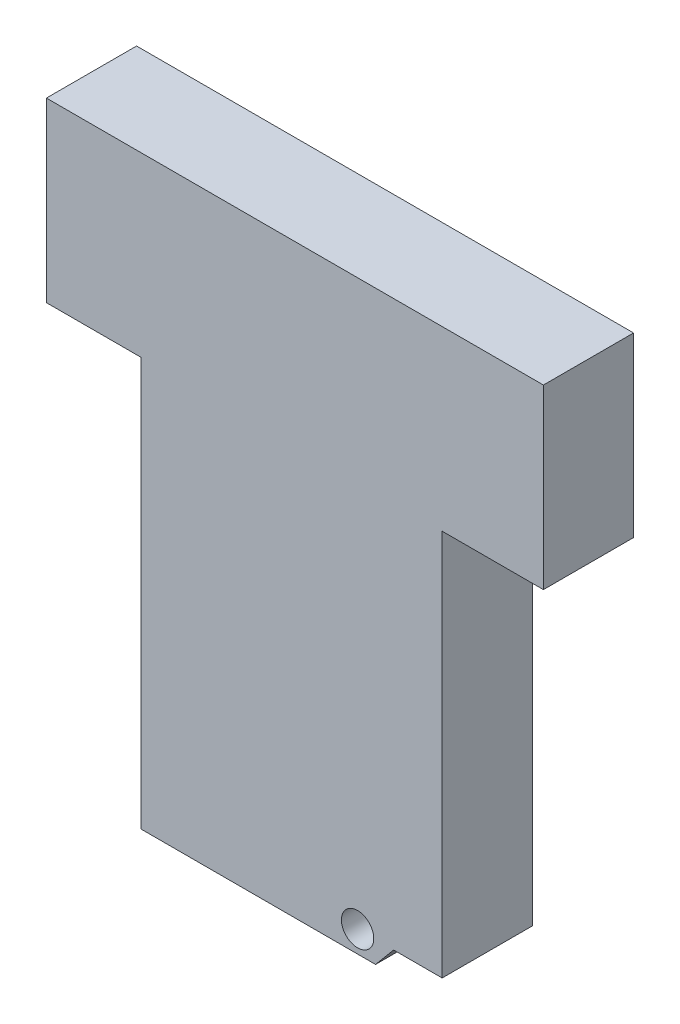
ISO-10303-21;
HEADER;
FILE_DESCRIPTION(('STEP AP214'),'2;1');
FILE_NAME('part.step','',(''),(''),'','','');
FILE_SCHEMA(('AUTOMOTIVE_DESIGN { 1 0 10303 214 1 1 1 1 }'));
ENDSEC;
DATA;
#1=APPLICATION_CONTEXT('core data for automotive mechanical design processes');
#2=APPLICATION_PROTOCOL_DEFINITION('international standard','automotive_design',2000,#1);
#3=PRODUCT_CONTEXT('',#1,'mechanical');
#4=PRODUCT('Part','Part','',(#3));
#5=PRODUCT_RELATED_PRODUCT_CATEGORY('part','',(#4));
#6=PRODUCT_DEFINITION_FORMATION('','',#4);
#7=PRODUCT_DEFINITION_CONTEXT('part definition',#1,'design');
#8=PRODUCT_DEFINITION('design','',#6,#7);
#9=PRODUCT_DEFINITION_SHAPE('','',#8);
#10=(LENGTH_UNIT() NAMED_UNIT(*) SI_UNIT(.MILLI.,.METRE.));
#11=(NAMED_UNIT(*) PLANE_ANGLE_UNIT() SI_UNIT($,.RADIAN.));
#12=(NAMED_UNIT(*) SI_UNIT($,.STERADIAN.) SOLID_ANGLE_UNIT());
#13=UNCERTAINTY_MEASURE_WITH_UNIT(LENGTH_MEASURE(1.E-05),#10,'distance_accuracy_value','');
#14=(GEOMETRIC_REPRESENTATION_CONTEXT(3) GLOBAL_UNCERTAINTY_ASSIGNED_CONTEXT((#13)) GLOBAL_UNIT_ASSIGNED_CONTEXT((#10,
#11,#12)) REPRESENTATION_CONTEXT('',''));
#15=CARTESIAN_POINT('',(0.,0.,0.));
#16=DIRECTION('',(0.,0.,1.));
#17=DIRECTION('',(1.,0.,0.));
#18=AXIS2_PLACEMENT_3D('',#15,#16,#17);
#19=CARTESIAN_POINT('',(0.,3.03999999999998,12.7));
#20=DIRECTION('',(0.,-1.,0.));
#21=DIRECTION('',(1.,0.,0.));
#22=AXIS2_PLACEMENT_3D('',#19,#20,#21);
#23=PLANE('',#22);
#24=DIRECTION('',(-1.,0.,0.));
#25=VECTOR('',#24,1.);
#26=CARTESIAN_POINT('',(0.,3.03999999999998,0.));
#27=LINE('',#26,#25);
#28=CARTESIAN_POINT('',(-14.2608206951941,3.03999999999997,0.));
#29=VERTEX_POINT('',#28);
#30=CARTESIAN_POINT('',(-21.0921656624926,3.03999999999997,0.));
#31=VERTEX_POINT('',#30);
#32=EDGE_CURVE('E213',#29,#31,#27,.T.);
#33=ORIENTED_EDGE('',*,*,#32,.F.);
#34=DIRECTION('',(0.,0.,-1.));
#35=VECTOR('',#34,1.);
#36=CARTESIAN_POINT('',(-14.2608206951941,3.03999999999997,12.7));
#37=LINE('',#36,#35);
#38=CARTESIAN_POINT('',(-14.2608206951941,3.03999999999997,12.7));
#39=VERTEX_POINT('',#38);
#40=EDGE_CURVE('E61',#39,#29,#37,.T.);
#41=ORIENTED_EDGE('',*,*,#40,.F.);
#42=DIRECTION('',(-1.,0.,0.));
#43=VECTOR('',#42,1.);
#44=CARTESIAN_POINT('',(0.,3.03999999999998,12.7));
#45=LINE('',#44,#43);
#46=CARTESIAN_POINT('',(-21.0921656624926,3.03999999999997,12.7));
#47=VERTEX_POINT('',#46);
#48=EDGE_CURVE('E194',#39,#47,#45,.T.);
#49=ORIENTED_EDGE('',*,*,#48,.T.);
#50=DIRECTION('',(0.,0.,-1.));
#51=VECTOR('',#50,1.);
#52=CARTESIAN_POINT('',(-21.0921656624926,3.03999999999997,12.7));
#53=LINE('',#52,#51);
#54=EDGE_CURVE('E225',#47,#31,#53,.T.);
#55=ORIENTED_EDGE('',*,*,#54,.T.);
#56=EDGE_LOOP('',(#33,#41,#49,#55));
#57=FACE_BOUND('',#56,.T.);
#58=ADVANCED_FACE('F43',(#57),#23,.T.);
#59=CARTESIAN_POINT('',(0.,3.03999999999998,12.7));
#60=DIRECTION('',(-1.,0.,0.));
#61=DIRECTION('',(0.,0.,1.));
#62=AXIS2_PLACEMENT_3D('',#59,#60,#61);
#63=PLANE('',#62);
#64=DIRECTION('',(0.,0.,-1.));
#65=VECTOR('',#64,1.);
#66=CARTESIAN_POINT('',(0.,57.54,12.7));
#67=LINE('',#66,#65);
#68=CARTESIAN_POINT('',(0.,57.54,12.7));
#69=VERTEX_POINT('',#68);
#70=CARTESIAN_POINT('',(0.,57.54,0.));
#71=VERTEX_POINT('',#70);
#72=EDGE_CURVE('E162',#69,#71,#67,.T.);
#73=ORIENTED_EDGE('',*,*,#72,.T.);
#74=DIRECTION('',(0.,1.,0.));
#75=VECTOR('',#74,1.);
#76=CARTESIAN_POINT('',(0.,3.03999999999998,0.));
#77=LINE('',#76,#75);
#78=CARTESIAN_POINT('',(0.,82.5,0.));
#79=VERTEX_POINT('',#78);
#80=EDGE_CURVE('E210',#71,#79,#77,.T.);
#81=ORIENTED_EDGE('',*,*,#80,.T.);
#82=DIRECTION('',(0.,0.,-1.));
#83=VECTOR('',#82,1.);
#84=CARTESIAN_POINT('',(0.,82.5,12.7));
#85=LINE('',#84,#83);
#86=CARTESIAN_POINT('',(0.,82.5,12.7));
#87=VERTEX_POINT('',#86);
#88=EDGE_CURVE('E228',#87,#79,#85,.T.);
#89=ORIENTED_EDGE('',*,*,#88,.F.);
#90=DIRECTION('',(0.,1.,0.));
#91=VECTOR('',#90,1.);
#92=CARTESIAN_POINT('',(0.,3.03999999999998,12.7));
#93=LINE('',#92,#91);
#94=EDGE_CURVE('E191',#69,#87,#93,.T.);
#95=ORIENTED_EDGE('',*,*,#94,.F.);
#96=EDGE_LOOP('',(#73,#81,#89,#95));
#97=FACE_BOUND('',#96,.T.);
#98=ADVANCED_FACE('F263',(#97),#63,.F.);
#99=CARTESIAN_POINT('',(0.,0.,12.7));
#100=DIRECTION('',(0.,0.,1.));
#101=DIRECTION('',(1.,0.,0.));
#102=AXIS2_PLACEMENT_3D('',#99,#100,#101);
#103=PLANE('',#102);
#104=CARTESIAN_POINT('',(-26.1738914200505,3.03999999999637,12.7));
#105=DIRECTION('',(0.,0.,1.));
#106=DIRECTION('',(1.,0.,0.));
#107=AXIS2_PLACEMENT_3D('',#104,#105,#106);
#108=CIRCLE('',#107,2.27762567555283);
#109=CARTESIAN_POINT('',(-23.8962657444976,3.03999999999637,12.7));
#110=VERTEX_POINT('',#109);
#111=EDGE_CURVE('E181',#110,#110,#108,.T.);
#112=ORIENTED_EDGE('',*,*,#111,.F.);
#113=EDGE_LOOP('',(#112));
#114=FACE_BOUND('',#113,.T.);
#115=DIRECTION('',(0.,-1.,0.));
#116=VECTOR('',#115,1.);
#117=CARTESIAN_POINT('',(-56.6430285412716,0.,12.7));
#118=LINE('',#117,#116);
#119=CARTESIAN_POINT('',(-56.6430285412716,57.54,12.7));
#120=VERTEX_POINT('',#119);
#121=CARTESIAN_POINT('',(-56.6430285412716,0.,12.7));
#122=VERTEX_POINT('',#121);
#123=EDGE_CURVE('E133',#120,#122,#118,.T.);
#124=ORIENTED_EDGE('',*,*,#123,.T.);
#125=DIRECTION('',(-1.,0.,0.));
#126=VECTOR('',#125,1.);
#127=CARTESIAN_POINT('',(-23.6430285412716,0.,12.7));
#128=LINE('',#127,#126);
#129=CARTESIAN_POINT('',(-23.6430285412716,0.,12.7));
#130=VERTEX_POINT('',#129);
#131=EDGE_CURVE('E201',#130,#122,#128,.T.);
#132=ORIENTED_EDGE('',*,*,#131,.F.);
#133=DIRECTION('',(0.64278760968654,0.766044443118977,0.));
#134=VECTOR('',#133,1.);
#135=CARTESIAN_POINT('',(-23.6430285412716,0.,12.7));
#136=LINE('',#135,#134);
#137=EDGE_CURVE('E197',#130,#47,#136,.T.);
#138=ORIENTED_EDGE('',*,*,#137,.T.);
#139=ORIENTED_EDGE('',*,*,#48,.F.);
#140=DIRECTION('',(0.,-1.,0.));
#141=VECTOR('',#140,1.);
#142=CARTESIAN_POINT('',(-14.2608206951941,0.,12.7));
#143=LINE('',#142,#141);
#144=CARTESIAN_POINT('',(-14.2608206951941,57.54,12.7));
#145=VERTEX_POINT('',#144);
#146=EDGE_CURVE('E166',#145,#39,#143,.T.);
#147=ORIENTED_EDGE('',*,*,#146,.F.);
#148=DIRECTION('',(-1.,0.,0.));
#149=VECTOR('',#148,1.);
#150=CARTESIAN_POINT('',(0.,57.54,12.7));
#151=LINE('',#150,#149);
#152=EDGE_CURVE('E170',#69,#145,#151,.T.);
#153=ORIENTED_EDGE('',*,*,#152,.F.);
#154=ORIENTED_EDGE('',*,*,#94,.T.);
#155=DIRECTION('',(-1.,0.,0.));
#156=VECTOR('',#155,1.);
#157=CARTESIAN_POINT('',(0.,82.5,12.7));
#158=LINE('',#157,#156);
#159=CARTESIAN_POINT('',(-70.,82.5,12.7));
#160=VERTEX_POINT('',#159);
#161=EDGE_CURVE('E187',#87,#160,#158,.T.);
#162=ORIENTED_EDGE('',*,*,#161,.T.);
#163=DIRECTION('',(0.,1.,0.));
#164=VECTOR('',#163,1.);
#165=CARTESIAN_POINT('',(-70.,3.03999999999998,12.7));
#166=LINE('',#165,#164);
#167=CARTESIAN_POINT('',(-70.,57.54,12.7));
#168=VERTEX_POINT('',#167);
#169=EDGE_CURVE('E143',#168,#160,#166,.T.);
#170=ORIENTED_EDGE('',*,*,#169,.F.);
#171=DIRECTION('',(1.,0.,0.));
#172=VECTOR('',#171,1.);
#173=CARTESIAN_POINT('',(0.,57.54,12.7));
#174=LINE('',#173,#172);
#175=EDGE_CURVE('E125',#168,#120,#174,.T.);
#176=ORIENTED_EDGE('',*,*,#175,.T.);
#177=EDGE_LOOP('',(#124,#132,#138,#139,#147,#153,#154,#162,#170,#176));
#178=FACE_BOUND('',#177,.T.);
#179=ADVANCED_FACE('F141',(#114,#178),#103,.T.);
#180=CARTESIAN_POINT('',(0.,0.,0.));
#181=DIRECTION('',(0.,0.,1.));
#182=DIRECTION('',(1.,0.,0.));
#183=AXIS2_PLACEMENT_3D('',#180,#181,#182);
#184=PLANE('',#183);
#185=CARTESIAN_POINT('',(-26.1738914200505,3.03999999999637,0.));
#186=DIRECTION('',(0.,0.,1.));
#187=DIRECTION('',(1.,0.,0.));
#188=AXIS2_PLACEMENT_3D('',#185,#186,#187);
#189=CIRCLE('',#188,2.27762567555283);
#190=CARTESIAN_POINT('',(-23.8962657444976,3.03999999999637,0.));
#191=VERTEX_POINT('',#190);
#192=EDGE_CURVE('E159',#191,#191,#189,.T.);
#193=ORIENTED_EDGE('',*,*,#192,.T.);
#194=EDGE_LOOP('',(#193));
#195=FACE_BOUND('',#194,.T.);
#196=DIRECTION('',(-1.,0.,0.));
#197=VECTOR('',#196,1.);
#198=CARTESIAN_POINT('',(-23.6430285412716,0.,0.));
#199=LINE('',#198,#197);
#200=CARTESIAN_POINT('',(-23.6430285412716,0.,0.));
#201=VERTEX_POINT('',#200);
#202=CARTESIAN_POINT('',(-56.6430285412716,0.,0.));
#203=VERTEX_POINT('',#202);
#204=EDGE_CURVE('E188',#201,#203,#199,.T.);
#205=ORIENTED_EDGE('',*,*,#204,.T.);
#206=DIRECTION('',(0.,-1.,0.));
#207=VECTOR('',#206,1.);
#208=CARTESIAN_POINT('',(-56.6430285412716,0.,0.));
#209=LINE('',#208,#207);
#210=CARTESIAN_POINT('',(-56.6430285412716,57.54,0.));
#211=VERTEX_POINT('',#210);
#212=EDGE_CURVE('E149',#211,#203,#209,.T.);
#213=ORIENTED_EDGE('',*,*,#212,.F.);
#214=DIRECTION('',(1.,0.,0.));
#215=VECTOR('',#214,1.);
#216=CARTESIAN_POINT('',(0.,57.54,0.));
#217=LINE('',#216,#215);
#218=CARTESIAN_POINT('',(-70.,57.54,0.));
#219=VERTEX_POINT('',#218);
#220=EDGE_CURVE('E126',#219,#211,#217,.T.);
#221=ORIENTED_EDGE('',*,*,#220,.F.);
#222=DIRECTION('',(0.,1.,0.));
#223=VECTOR('',#222,1.);
#224=CARTESIAN_POINT('',(-70.,3.03999999999998,0.));
#225=LINE('',#224,#223);
#226=CARTESIAN_POINT('',(-70.,82.5,0.));
#227=VERTEX_POINT('',#226);
#228=EDGE_CURVE('E130',#219,#227,#225,.T.);
#229=ORIENTED_EDGE('',*,*,#228,.T.);
#230=DIRECTION('',(-1.,0.,0.));
#231=VECTOR('',#230,1.);
#232=CARTESIAN_POINT('',(0.,82.5,0.));
#233=LINE('',#232,#231);
#234=EDGE_CURVE('E206',#79,#227,#233,.T.);
#235=ORIENTED_EDGE('',*,*,#234,.F.);
#236=ORIENTED_EDGE('',*,*,#80,.F.);
#237=DIRECTION('',(-1.,0.,0.));
#238=VECTOR('',#237,1.);
#239=CARTESIAN_POINT('',(0.,57.54,0.));
#240=LINE('',#239,#238);
#241=CARTESIAN_POINT('',(-14.2608206951941,57.54,0.));
#242=VERTEX_POINT('',#241);
#243=EDGE_CURVE('E152',#71,#242,#240,.T.);
#244=ORIENTED_EDGE('',*,*,#243,.T.);
#245=DIRECTION('',(0.,-1.,0.));
#246=VECTOR('',#245,1.);
#247=CARTESIAN_POINT('',(-14.2608206951941,0.,0.));
#248=LINE('',#247,#246);
#249=EDGE_CURVE('E167',#242,#29,#248,.T.);
#250=ORIENTED_EDGE('',*,*,#249,.T.);
#251=ORIENTED_EDGE('',*,*,#32,.T.);
#252=DIRECTION('',(0.64278760968654,0.766044443118977,0.));
#253=VECTOR('',#252,1.);
#254=CARTESIAN_POINT('',(-23.6430285412716,0.,0.));
#255=LINE('',#254,#253);
#256=EDGE_CURVE('E216',#201,#31,#255,.T.);
#257=ORIENTED_EDGE('',*,*,#256,.F.);
#258=EDGE_LOOP('',(#205,#213,#221,#229,#235,#236,#244,#250,#251,#257));
#259=FACE_BOUND('',#258,.T.);
#260=ADVANCED_FACE('F243',(#195,#259),#184,.F.);
#261=CARTESIAN_POINT('',(-70.,3.03999999999998,12.7));
#262=DIRECTION('',(-1.,0.,0.));
#263=DIRECTION('',(0.,0.,1.));
#264=AXIS2_PLACEMENT_3D('',#261,#262,#263);
#265=PLANE('',#264);
#266=DIRECTION('',(0.,0.,-1.));
#267=VECTOR('',#266,1.);
#268=CARTESIAN_POINT('',(-70.,57.54,12.7));
#269=LINE('',#268,#267);
#270=EDGE_CURVE('E69',#168,#219,#269,.T.);
#271=ORIENTED_EDGE('',*,*,#270,.F.);
#272=ORIENTED_EDGE('',*,*,#169,.T.);
#273=DIRECTION('',(0.,0.,-1.));
#274=VECTOR('',#273,1.);
#275=CARTESIAN_POINT('',(-70.,82.5,12.7));
#276=LINE('',#275,#274);
#277=EDGE_CURVE('E47',#160,#227,#276,.T.);
#278=ORIENTED_EDGE('',*,*,#277,.T.);
#279=ORIENTED_EDGE('',*,*,#228,.F.);
#280=EDGE_LOOP('',(#271,#272,#278,#279));
#281=FACE_BOUND('',#280,.T.);
#282=ADVANCED_FACE('F45',(#281),#265,.T.);
#283=CARTESIAN_POINT('',(-23.6430285412716,0.,12.7));
#284=DIRECTION('',(0.,-1.,0.));
#285=DIRECTION('',(1.,0.,0.));
#286=AXIS2_PLACEMENT_3D('',#283,#284,#285);
#287=PLANE('',#286);
#288=ORIENTED_EDGE('',*,*,#204,.F.);
#289=DIRECTION('',(0.,0.,-1.));
#290=VECTOR('',#289,1.);
#291=CARTESIAN_POINT('',(-23.6430285412716,0.,12.7));
#292=LINE('',#291,#290);
#293=EDGE_CURVE('E53',#130,#201,#292,.T.);
#294=ORIENTED_EDGE('',*,*,#293,.F.);
#295=ORIENTED_EDGE('',*,*,#131,.T.);
#296=DIRECTION('',(0.,0.,-1.));
#297=VECTOR('',#296,1.);
#298=CARTESIAN_POINT('',(-56.6430285412716,0.,12.7));
#299=LINE('',#298,#297);
#300=EDGE_CURVE('E11',#122,#203,#299,.T.);
#301=ORIENTED_EDGE('',*,*,#300,.T.);
#302=EDGE_LOOP('',(#288,#294,#295,#301));
#303=FACE_BOUND('',#302,.T.);
#304=ADVANCED_FACE('F247',(#303),#287,.T.);
#305=CARTESIAN_POINT('',(-23.6430285412716,0.,12.7));
#306=DIRECTION('',(-0.766044443118977,0.64278760968654,0.));
#307=DIRECTION('',(-0.64278760968654,-0.766044443118977,0.));
#308=AXIS2_PLACEMENT_3D('',#305,#306,#307);
#309=PLANE('',#308);
#310=ORIENTED_EDGE('',*,*,#256,.T.);
#311=ORIENTED_EDGE('',*,*,#54,.F.);
#312=ORIENTED_EDGE('',*,*,#137,.F.);
#313=ORIENTED_EDGE('',*,*,#293,.T.);
#314=EDGE_LOOP('',(#310,#311,#312,#313));
#315=FACE_BOUND('',#314,.T.);
#316=ADVANCED_FACE('F253',(#315),#309,.F.);
#317=CARTESIAN_POINT('',(0.,82.5,12.7));
#318=DIRECTION('',(0.,-1.,0.));
#319=DIRECTION('',(1.,0.,0.));
#320=AXIS2_PLACEMENT_3D('',#317,#318,#319);
#321=PLANE('',#320);
#322=ORIENTED_EDGE('',*,*,#234,.T.);
#323=ORIENTED_EDGE('',*,*,#277,.F.);
#324=ORIENTED_EDGE('',*,*,#161,.F.);
#325=ORIENTED_EDGE('',*,*,#88,.T.);
#326=EDGE_LOOP('',(#322,#323,#324,#325));
#327=FACE_BOUND('',#326,.T.);
#328=ADVANCED_FACE('F240',(#327),#321,.F.);
#329=CARTESIAN_POINT('',(-26.1738914200505,3.03999999999637,12.7));
#330=DIRECTION('',(0.,0.,-1.));
#331=DIRECTION('',(-1.,0.,0.));
#332=AXIS2_PLACEMENT_3D('',#329,#330,#331);
#333=CYLINDRICAL_SURFACE('',#332,2.27762567555283);
#334=ORIENTED_EDGE('',*,*,#111,.T.);
#335=EDGE_LOOP('',(#334));
#336=FACE_BOUND('',#335,.T.);
#337=ORIENTED_EDGE('',*,*,#192,.F.);
#338=EDGE_LOOP('',(#337));
#339=FACE_BOUND('',#338,.T.);
#340=ADVANCED_FACE('F275',(#336,#339),#333,.F.);
#341=CARTESIAN_POINT('',(0.,57.54,12.7));
#342=DIRECTION('',(0.,-1.,0.));
#343=DIRECTION('',(0.,0.,-1.));
#344=AXIS2_PLACEMENT_3D('',#341,#342,#343);
#345=PLANE('',#344);
#346=ORIENTED_EDGE('',*,*,#243,.F.);
#347=ORIENTED_EDGE('',*,*,#72,.F.);
#348=ORIENTED_EDGE('',*,*,#152,.T.);
#349=DIRECTION('',(0.,0.,-1.));
#350=VECTOR('',#349,1.);
#351=CARTESIAN_POINT('',(-14.2608206951941,57.54,12.7));
#352=LINE('',#351,#350);
#353=EDGE_CURVE('E155',#145,#242,#352,.T.);
#354=ORIENTED_EDGE('',*,*,#353,.T.);
#355=EDGE_LOOP('',(#346,#347,#348,#354));
#356=FACE_BOUND('',#355,.T.);
#357=ADVANCED_FACE('F259',(#356),#345,.T.);
#358=CARTESIAN_POINT('',(-14.2608206951941,0.,12.7));
#359=DIRECTION('',(1.,0.,0.));
#360=DIRECTION('',(0.,0.,-1.));
#361=AXIS2_PLACEMENT_3D('',#358,#359,#360);
#362=PLANE('',#361);
#363=ORIENTED_EDGE('',*,*,#249,.F.);
#364=ORIENTED_EDGE('',*,*,#353,.F.);
#365=ORIENTED_EDGE('',*,*,#146,.T.);
#366=ORIENTED_EDGE('',*,*,#40,.T.);
#367=EDGE_LOOP('',(#363,#364,#365,#366));
#368=FACE_BOUND('',#367,.T.);
#369=ADVANCED_FACE('F257',(#368),#362,.T.);
#370=CARTESIAN_POINT('',(-56.6430285412716,0.,12.7));
#371=DIRECTION('',(1.,0.,0.));
#372=DIRECTION('',(0.,0.,-1.));
#373=AXIS2_PLACEMENT_3D('',#370,#371,#372);
#374=PLANE('',#373);
#375=ORIENTED_EDGE('',*,*,#212,.T.);
#376=ORIENTED_EDGE('',*,*,#300,.F.);
#377=ORIENTED_EDGE('',*,*,#123,.F.);
#378=DIRECTION('',(0.,0.,-1.));
#379=VECTOR('',#378,1.);
#380=CARTESIAN_POINT('',(-56.6430285412716,57.54,12.7));
#381=LINE('',#380,#379);
#382=EDGE_CURVE('E121',#120,#211,#381,.T.);
#383=ORIENTED_EDGE('',*,*,#382,.T.);
#384=EDGE_LOOP('',(#375,#376,#377,#383));
#385=FACE_BOUND('',#384,.T.);
#386=ADVANCED_FACE('F134',(#385),#374,.F.);
#387=CARTESIAN_POINT('',(0.,57.54,12.7));
#388=DIRECTION('',(0.,1.,0.));
#389=DIRECTION('',(0.,0.,1.));
#390=AXIS2_PLACEMENT_3D('',#387,#388,#389);
#391=PLANE('',#390);
#392=ORIENTED_EDGE('',*,*,#220,.T.);
#393=ORIENTED_EDGE('',*,*,#382,.F.);
#394=ORIENTED_EDGE('',*,*,#175,.F.);
#395=ORIENTED_EDGE('',*,*,#270,.T.);
#396=EDGE_LOOP('',(#392,#393,#394,#395));
#397=FACE_BOUND('',#396,.T.);
#398=ADVANCED_FACE('F123',(#397),#391,.F.);
#399=CLOSED_SHELL('',(#58,#98,#179,#260,#282,#304,#316,#328,#340,#357,#369,#386,#398));
#400=MANIFOLD_SOLID_BREP('B2',#399);
#401=ADVANCED_BREP_SHAPE_REPRESENTATION('',(#18,#400),#14);
#402=SHAPE_DEFINITION_REPRESENTATION(#9,#401);
ENDSEC;
END-ISO-10303-21;
